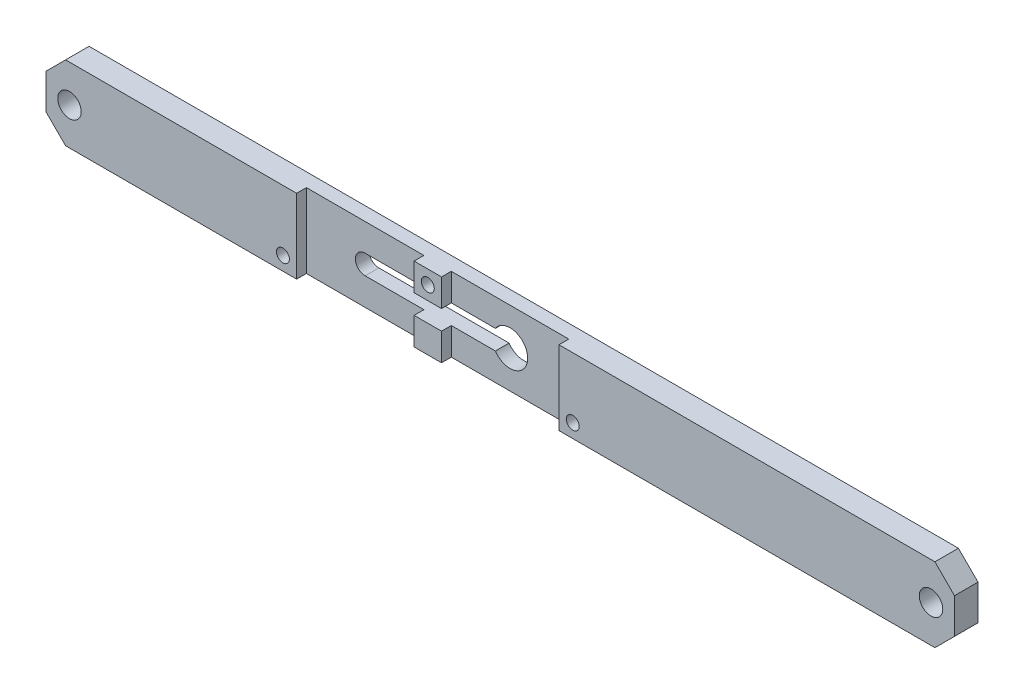
ISO-10303-21;
HEADER;
FILE_DESCRIPTION(('STEP AP214'),'2;1');
FILE_NAME('part.step','',(''),(''),'','','');
FILE_SCHEMA(('AUTOMOTIVE_DESIGN { 1 0 10303 214 1 1 1 1 }'));
ENDSEC;
DATA;
#1=APPLICATION_CONTEXT('core data for automotive mechanical design processes');
#2=APPLICATION_PROTOCOL_DEFINITION('international standard','automotive_design',2000,#1);
#3=PRODUCT_CONTEXT('',#1,'mechanical');
#4=PRODUCT('Part','Part','',(#3));
#5=PRODUCT_RELATED_PRODUCT_CATEGORY('part','',(#4));
#6=PRODUCT_DEFINITION_FORMATION('','',#4);
#7=PRODUCT_DEFINITION_CONTEXT('part definition',#1,'design');
#8=PRODUCT_DEFINITION('design','',#6,#7);
#9=PRODUCT_DEFINITION_SHAPE('','',#8);
#10=(LENGTH_UNIT() NAMED_UNIT(*) SI_UNIT(.MILLI.,.METRE.));
#11=(NAMED_UNIT(*) PLANE_ANGLE_UNIT() SI_UNIT($,.RADIAN.));
#12=(NAMED_UNIT(*) SI_UNIT($,.STERADIAN.) SOLID_ANGLE_UNIT());
#13=UNCERTAINTY_MEASURE_WITH_UNIT(LENGTH_MEASURE(1.E-05),#10,'distance_accuracy_value','');
#14=(GEOMETRIC_REPRESENTATION_CONTEXT(3) GLOBAL_UNCERTAINTY_ASSIGNED_CONTEXT((#13)) GLOBAL_UNIT_ASSIGNED_CONTEXT((#10,
#11,#12)) REPRESENTATION_CONTEXT('',''));
#15=CARTESIAN_POINT('',(0.,0.,0.));
#16=DIRECTION('',(0.,0.,1.));
#17=DIRECTION('',(1.,0.,0.));
#18=AXIS2_PLACEMENT_3D('',#15,#16,#17);
#19=CARTESIAN_POINT('',(0.,0.,6.));
#20=DIRECTION('',(0.,0.,1.));
#21=DIRECTION('',(1.,0.,0.));
#22=AXIS2_PLACEMENT_3D('',#19,#20,#21);
#23=PLANE('',#22);
#24=CARTESIAN_POINT('',(-18.5000000000002,6.,6.));
#25=DIRECTION('',(0.,0.,-1.));
#26=DIRECTION('',(-1.,0.,0.));
#27=AXIS2_PLACEMENT_3D('',#24,#25,#26);
#28=CIRCLE('',#27,1.65);
#29=CARTESIAN_POINT('',(-20.1500000000002,6.,6.));
#30=VERTEX_POINT('',#29);
#31=EDGE_CURVE('E741',#30,#30,#28,.T.);
#32=ORIENTED_EDGE('',*,*,#31,.T.);
#33=EDGE_LOOP('',(#32));
#34=FACE_BOUND('',#33,.T.);
#35=DIRECTION('',(0.,1.,0.));
#36=VECTOR('',#35,1.);
#37=CARTESIAN_POINT('',(-22.0000000000002,9.50000000000001,6.));
#38=LINE('',#37,#36);
#39=CARTESIAN_POINT('',(-22.0000000000002,2.5,6.));
#40=VERTEX_POINT('',#39);
#41=CARTESIAN_POINT('',(-22.0000000000002,9.50000000000001,6.));
#42=VERTEX_POINT('',#41);
#43=EDGE_CURVE('E293',#40,#42,#38,.T.);
#44=ORIENTED_EDGE('',*,*,#43,.F.);
#45=DIRECTION('',(1.,0.,0.));
#46=VECTOR('',#45,1.);
#47=CARTESIAN_POINT('',(0.,2.5,6.));
#48=LINE('',#47,#46);
#49=CARTESIAN_POINT('',(-15.0000000000002,2.5,6.));
#50=VERTEX_POINT('',#49);
#51=EDGE_CURVE('E234',#40,#50,#48,.T.);
#52=ORIENTED_EDGE('',*,*,#51,.T.);
#53=DIRECTION('',(0.,-1.,0.));
#54=VECTOR('',#53,1.);
#55=CARTESIAN_POINT('',(-15.0000000000002,9.50000000000001,6.));
#56=LINE('',#55,#54);
#57=CARTESIAN_POINT('',(-15.0000000000002,9.50000000000001,6.));
#58=VERTEX_POINT('',#57);
#59=EDGE_CURVE('E298',#58,#50,#56,.T.);
#60=ORIENTED_EDGE('',*,*,#59,.F.);
#61=DIRECTION('',(-1.,0.,0.));
#62=VECTOR('',#61,1.);
#63=CARTESIAN_POINT('',(116.,9.50000000000001,6.));
#64=LINE('',#63,#62);
#65=EDGE_CURVE('E349',#58,#42,#64,.T.);
#66=ORIENTED_EDGE('',*,*,#65,.T.);
#67=EDGE_LOOP('',(#44,#52,#60,#66));
#68=FACE_BOUND('',#67,.T.);
#69=ADVANCED_FACE('F44',(#34,#68),#23,.T.);
#70=CARTESIAN_POINT('',(-15.0000000000002,9.50000000000001,3.5));
#71=DIRECTION('',(-1.,0.,0.));
#72=DIRECTION('',(0.,0.,1.));
#73=AXIS2_PLACEMENT_3D('',#70,#71,#72);
#74=PLANE('',#73);
#75=DIRECTION('',(0.,0.,1.));
#76=VECTOR('',#75,1.);
#77=CARTESIAN_POINT('',(-15.0000000000002,2.5,3.5));
#78=LINE('',#77,#76);
#79=CARTESIAN_POINT('',(-15.0000000000002,2.5,3.5));
#80=VERTEX_POINT('',#79);
#81=EDGE_CURVE('E254',#80,#50,#78,.T.);
#82=ORIENTED_EDGE('',*,*,#81,.F.);
#83=DIRECTION('',(0.,-1.,0.));
#84=VECTOR('',#83,1.);
#85=CARTESIAN_POINT('',(-15.0000000000002,9.50000000000001,3.5));
#86=LINE('',#85,#84);
#87=CARTESIAN_POINT('',(-15.0000000000002,9.50000000000001,3.5));
#88=VERTEX_POINT('',#87);
#89=EDGE_CURVE('E329',#88,#80,#86,.T.);
#90=ORIENTED_EDGE('',*,*,#89,.F.);
#91=DIRECTION('',(0.,0.,1.));
#92=VECTOR('',#91,1.);
#93=CARTESIAN_POINT('',(-15.0000000000002,9.50000000000001,3.5));
#94=LINE('',#93,#92);
#95=EDGE_CURVE('E310',#88,#58,#94,.T.);
#96=ORIENTED_EDGE('',*,*,#95,.T.);
#97=ORIENTED_EDGE('',*,*,#59,.T.);
#98=EDGE_LOOP('',(#82,#90,#96,#97));
#99=FACE_BOUND('',#98,.T.);
#100=ADVANCED_FACE('F477',(#99),#74,.F.);
#101=CARTESIAN_POINT('',(-22.0000000000002,9.50000000000001,3.5));
#102=DIRECTION('',(1.,0.,0.));
#103=DIRECTION('',(0.,0.,-1.));
#104=AXIS2_PLACEMENT_3D('',#101,#102,#103);
#105=PLANE('',#104);
#106=DIRECTION('',(0.,0.,-1.));
#107=VECTOR('',#106,1.);
#108=CARTESIAN_POINT('',(-22.0000000000002,2.5,3.5));
#109=LINE('',#108,#107);
#110=CARTESIAN_POINT('',(-22.0000000000002,2.5,3.5));
#111=VERTEX_POINT('',#110);
#112=EDGE_CURVE('E250',#40,#111,#109,.T.);
#113=ORIENTED_EDGE('',*,*,#112,.F.);
#114=ORIENTED_EDGE('',*,*,#43,.T.);
#115=DIRECTION('',(0.,0.,1.));
#116=VECTOR('',#115,1.);
#117=CARTESIAN_POINT('',(-22.0000000000002,9.50000000000001,3.5));
#118=LINE('',#117,#116);
#119=CARTESIAN_POINT('',(-22.0000000000002,9.50000000000001,3.5));
#120=VERTEX_POINT('',#119);
#121=EDGE_CURVE('E305',#120,#42,#118,.T.);
#122=ORIENTED_EDGE('',*,*,#121,.F.);
#123=DIRECTION('',(0.,1.,0.));
#124=VECTOR('',#123,1.);
#125=CARTESIAN_POINT('',(-22.0000000000002,9.50000000000001,3.5));
#126=LINE('',#125,#124);
#127=EDGE_CURVE('E284',#111,#120,#126,.T.);
#128=ORIENTED_EDGE('',*,*,#127,.F.);
#129=EDGE_LOOP('',(#113,#114,#122,#128));
#130=FACE_BOUND('',#129,.T.);
#131=ADVANCED_FACE('F466',(#130),#105,.F.);
#132=CARTESIAN_POINT('',(-55.5000000000002,-6.,6.));
#133=DIRECTION('',(0.,0.,-1.));
#134=DIRECTION('',(-1.,0.,0.));
#135=AXIS2_PLACEMENT_3D('',#132,#133,#134);
#136=CIRCLE('',#135,1.65);
#137=CARTESIAN_POINT('',(-57.1500000000002,-6.,6.));
#138=VERTEX_POINT('',#137);
#139=EDGE_CURVE('E754',#138,#138,#136,.T.);
#140=ORIENTED_EDGE('',*,*,#139,.T.);
#141=EDGE_LOOP('',(#140));
#142=FACE_BOUND('',#141,.T.);
#143=CARTESIAN_POINT('',(-110.,0.,6.));
#144=DIRECTION('',(0.,0.,1.));
#145=DIRECTION('',(1.,0.,0.));
#146=AXIS2_PLACEMENT_3D('',#143,#144,#145);
#147=CIRCLE('',#146,3.00000000000001);
#148=CARTESIAN_POINT('',(-107.,0.,6.));
#149=VERTEX_POINT('',#148);
#150=EDGE_CURVE('E275',#149,#149,#147,.T.);
#151=ORIENTED_EDGE('',*,*,#150,.F.);
#152=EDGE_LOOP('',(#151));
#153=FACE_BOUND('',#152,.T.);
#154=CARTESIAN_POINT('',(-52.0000000000002,9.50000000000001,6.));
#155=VERTEX_POINT('',#154);
#156=CARTESIAN_POINT('',(-111.,9.50000000000001,6.));
#157=VERTEX_POINT('',#156);
#158=EDGE_CURVE('E343',#155,#157,#64,.T.);
#159=ORIENTED_EDGE('',*,*,#158,.T.);
#160=DIRECTION('',(0.707106781186549,0.707106781186546,0.));
#161=VECTOR('',#160,1.);
#162=CARTESIAN_POINT('',(-60.2499999999998,60.2500000000001,6.));
#163=LINE('',#162,#161);
#164=CARTESIAN_POINT('',(-116.,4.5,6.));
#165=VERTEX_POINT('',#164);
#166=EDGE_CURVE('E11',#157,#165,#163,.F.);
#167=ORIENTED_EDGE('',*,*,#166,.T.);
#168=DIRECTION('',(0.,-1.,0.));
#169=VECTOR('',#168,1.);
#170=CARTESIAN_POINT('',(-116.,-9.49999999999999,6.));
#171=LINE('',#170,#169);
#172=CARTESIAN_POINT('',(-116.,-4.50000000000002,6.));
#173=VERTEX_POINT('',#172);
#174=EDGE_CURVE('E333',#165,#173,#171,.T.);
#175=ORIENTED_EDGE('',*,*,#174,.T.);
#176=DIRECTION('',(-0.707106781186548,0.707106781186548,0.));
#177=VECTOR('',#176,1.);
#178=CARTESIAN_POINT('',(-60.2500000000001,-60.2500000000001,6.));
#179=LINE('',#178,#177);
#180=CARTESIAN_POINT('',(-111.,-9.49999999999999,6.));
#181=VERTEX_POINT('',#180);
#182=EDGE_CURVE('E53',#173,#181,#179,.F.);
#183=ORIENTED_EDGE('',*,*,#182,.T.);
#184=DIRECTION('',(1.,0.,0.));
#185=VECTOR('',#184,1.);
#186=CARTESIAN_POINT('',(116.,-9.49999999999999,6.));
#187=LINE('',#186,#185);
#188=CARTESIAN_POINT('',(-52.0000000000002,-9.49999999999999,6.));
#189=VERTEX_POINT('',#188);
#190=EDGE_CURVE('E339',#181,#189,#187,.T.);
#191=ORIENTED_EDGE('',*,*,#190,.T.);
#192=DIRECTION('',(0.,-1.,0.));
#193=VECTOR('',#192,1.);
#194=CARTESIAN_POINT('',(-52.0000000000002,9.50000000000001,6.));
#195=LINE('',#194,#193);
#196=EDGE_CURVE('E295',#155,#189,#195,.T.);
#197=ORIENTED_EDGE('',*,*,#196,.F.);
#198=EDGE_LOOP('',(#159,#167,#175,#183,#191,#197));
#199=FACE_BOUND('',#198,.T.);
#200=ADVANCED_FACE('F396',(#142,#153,#199),#23,.T.);
#201=DIRECTION('',(1.,0.,0.));
#202=VECTOR('',#201,1.);
#203=CARTESIAN_POINT('',(0.,-2.5,6.));
#204=LINE('',#203,#202);
#205=CARTESIAN_POINT('',(-22.0000000000002,-2.5,6.));
#206=VERTEX_POINT('',#205);
#207=CARTESIAN_POINT('',(-15.0000000000002,-2.5,6.));
#208=VERTEX_POINT('',#207);
#209=EDGE_CURVE('E237',#206,#208,#204,.T.);
#210=ORIENTED_EDGE('',*,*,#209,.F.);
#211=CARTESIAN_POINT('',(-22.0000000000002,-9.49999999999999,6.));
#212=VERTEX_POINT('',#211);
#213=EDGE_CURVE('E283',#212,#206,#38,.T.);
#214=ORIENTED_EDGE('',*,*,#213,.F.);
#215=CARTESIAN_POINT('',(-15.0000000000002,-9.49999999999999,6.));
#216=VERTEX_POINT('',#215);
#217=EDGE_CURVE('E345',#212,#216,#187,.T.);
#218=ORIENTED_EDGE('',*,*,#217,.T.);
#219=EDGE_CURVE('E325',#208,#216,#56,.T.);
#220=ORIENTED_EDGE('',*,*,#219,.F.);
#221=EDGE_LOOP('',(#210,#214,#218,#220));
#222=FACE_BOUND('',#221,.T.);
#223=ADVANCED_FACE('F443',(#222),#23,.T.);
#224=CARTESIAN_POINT('',(-116.,-9.49999999999999,6.));
#225=DIRECTION('',(1.,0.,0.));
#226=DIRECTION('',(0.,0.,-1.));
#227=AXIS2_PLACEMENT_3D('',#224,#225,#226);
#228=PLANE('',#227);
#229=ORIENTED_EDGE('',*,*,#174,.F.);
#230=DIRECTION('',(0.,0.,-1.));
#231=VECTOR('',#230,1.);
#232=CARTESIAN_POINT('',(-116.,4.5,6.));
#233=LINE('',#232,#231);
#234=CARTESIAN_POINT('',(-116.,4.5,0.));
#235=VERTEX_POINT('',#234);
#236=EDGE_CURVE('E392',#165,#235,#233,.T.);
#237=ORIENTED_EDGE('',*,*,#236,.T.);
#238=DIRECTION('',(0.,-1.,0.));
#239=VECTOR('',#238,1.);
#240=CARTESIAN_POINT('',(-116.,-9.49999999999999,0.));
#241=LINE('',#240,#239);
#242=CARTESIAN_POINT('',(-116.,-4.50000000000002,0.));
#243=VERTEX_POINT('',#242);
#244=EDGE_CURVE('E302',#235,#243,#241,.T.);
#245=ORIENTED_EDGE('',*,*,#244,.T.);
#246=DIRECTION('',(0.,0.,1.));
#247=VECTOR('',#246,1.);
#248=CARTESIAN_POINT('',(-116.,-4.50000000000002,6.));
#249=LINE('',#248,#247);
#250=EDGE_CURVE('E63',#243,#173,#249,.T.);
#251=ORIENTED_EDGE('',*,*,#250,.T.);
#252=EDGE_LOOP('',(#229,#237,#245,#251));
#253=FACE_BOUND('',#252,.T.);
#254=ADVANCED_FACE('F407',(#253),#228,.F.);
#255=CARTESIAN_POINT('',(116.,-9.49999999999999,6.));
#256=DIRECTION('',(0.,1.,0.));
#257=DIRECTION('',(0.,0.,1.));
#258=AXIS2_PLACEMENT_3D('',#255,#256,#257);
#259=PLANE('',#258);
#260=DIRECTION('',(1.,0.,0.));
#261=VECTOR('',#260,1.);
#262=CARTESIAN_POINT('',(116.,-9.49999999999999,0.));
#263=LINE('',#262,#261);
#264=CARTESIAN_POINT('',(-111.,-9.49999999999999,0.));
#265=VERTEX_POINT('',#264);
#266=CARTESIAN_POINT('',(111.,-9.49999999999999,0.));
#267=VERTEX_POINT('',#266);
#268=EDGE_CURVE('E353',#265,#267,#263,.T.);
#269=ORIENTED_EDGE('',*,*,#268,.T.);
#270=DIRECTION('',(0.,0.,1.));
#271=VECTOR('',#270,1.);
#272=CARTESIAN_POINT('',(111.,-9.49999999999999,6.));
#273=LINE('',#272,#271);
#274=CARTESIAN_POINT('',(111.,-9.49999999999999,6.));
#275=VERTEX_POINT('',#274);
#276=EDGE_CURVE('E382',#267,#275,#273,.T.);
#277=ORIENTED_EDGE('',*,*,#276,.T.);
#278=CARTESIAN_POINT('',(14.9999999999998,-9.49999999999999,6.));
#279=VERTEX_POINT('',#278);
#280=EDGE_CURVE('E340',#279,#275,#187,.T.);
#281=ORIENTED_EDGE('',*,*,#280,.F.);
#282=DIRECTION('',(0.,0.,1.));
#283=VECTOR('',#282,1.);
#284=CARTESIAN_POINT('',(14.9999999999998,-9.49999999999999,3.5));
#285=LINE('',#284,#283);
#286=CARTESIAN_POINT('',(14.9999999999998,-9.49999999999999,3.5));
#287=VERTEX_POINT('',#286);
#288=EDGE_CURVE('E312',#287,#279,#285,.T.);
#289=ORIENTED_EDGE('',*,*,#288,.F.);
#290=DIRECTION('',(1.,0.,0.));
#291=VECTOR('',#290,1.);
#292=CARTESIAN_POINT('',(-15.0000000000002,-9.49999999999999,3.5));
#293=LINE('',#292,#291);
#294=CARTESIAN_POINT('',(-15.0000000000002,-9.49999999999999,3.5));
#295=VERTEX_POINT('',#294);
#296=EDGE_CURVE('E330',#295,#287,#293,.T.);
#297=ORIENTED_EDGE('',*,*,#296,.F.);
#298=DIRECTION('',(0.,0.,1.));
#299=VECTOR('',#298,1.);
#300=CARTESIAN_POINT('',(-15.0000000000002,-9.49999999999999,3.5));
#301=LINE('',#300,#299);
#302=EDGE_CURVE('E315',#295,#216,#301,.T.);
#303=ORIENTED_EDGE('',*,*,#302,.T.);
#304=ORIENTED_EDGE('',*,*,#217,.F.);
#305=DIRECTION('',(0.,0.,1.));
#306=VECTOR('',#305,1.);
#307=CARTESIAN_POINT('',(-22.0000000000002,-9.49999999999999,3.5));
#308=LINE('',#307,#306);
#309=CARTESIAN_POINT('',(-22.0000000000002,-9.49999999999999,3.5));
#310=VERTEX_POINT('',#309);
#311=EDGE_CURVE('E303',#310,#212,#308,.T.);
#312=ORIENTED_EDGE('',*,*,#311,.F.);
#313=DIRECTION('',(1.,0.,0.));
#314=VECTOR('',#313,1.);
#315=CARTESIAN_POINT('',(-52.0000000000002,-9.49999999999999,3.5));
#316=LINE('',#315,#314);
#317=CARTESIAN_POINT('',(-52.0000000000002,-9.49999999999999,3.5));
#318=VERTEX_POINT('',#317);
#319=EDGE_CURVE('E278',#318,#310,#316,.T.);
#320=ORIENTED_EDGE('',*,*,#319,.F.);
#321=DIRECTION('',(0.,0.,1.));
#322=VECTOR('',#321,1.);
#323=CARTESIAN_POINT('',(-52.0000000000002,-9.49999999999999,3.5));
#324=LINE('',#323,#322);
#325=EDGE_CURVE('E292',#318,#189,#324,.T.);
#326=ORIENTED_EDGE('',*,*,#325,.T.);
#327=ORIENTED_EDGE('',*,*,#190,.F.);
#328=DIRECTION('',(0.,0.,-1.));
#329=VECTOR('',#328,1.);
#330=CARTESIAN_POINT('',(-111.,-9.49999999999999,6.));
#331=LINE('',#330,#329);
#332=EDGE_CURVE('E379',#181,#265,#331,.T.);
#333=ORIENTED_EDGE('',*,*,#332,.T.);
#334=EDGE_LOOP('',(#269,#277,#281,#289,#297,#303,#304,#312,#320,#326,#327,#333));
#335=FACE_BOUND('',#334,.T.);
#336=ADVANCED_FACE('F404',(#335),#259,.F.);
#337=CARTESIAN_POINT('',(116.,-9.49999999999999,6.));
#338=DIRECTION('',(-1.,0.,0.));
#339=DIRECTION('',(0.,0.,1.));
#340=AXIS2_PLACEMENT_3D('',#337,#338,#339);
#341=PLANE('',#340);
#342=DIRECTION('',(0.,1.,0.));
#343=VECTOR('',#342,1.);
#344=CARTESIAN_POINT('',(116.,-9.49999999999999,6.));
#345=LINE('',#344,#343);
#346=CARTESIAN_POINT('',(116.,-4.49999999999999,6.));
#347=VERTEX_POINT('',#346);
#348=CARTESIAN_POINT('',(116.,4.49999999999998,6.));
#349=VERTEX_POINT('',#348);
#350=EDGE_CURVE('E342',#347,#349,#345,.T.);
#351=ORIENTED_EDGE('',*,*,#350,.F.);
#352=DIRECTION('',(0.,0.,-1.));
#353=VECTOR('',#352,1.);
#354=CARTESIAN_POINT('',(116.,-4.49999999999999,6.));
#355=LINE('',#354,#353);
#356=CARTESIAN_POINT('',(116.,-4.49999999999999,0.));
#357=VERTEX_POINT('',#356);
#358=EDGE_CURVE('E369',#347,#357,#355,.T.);
#359=ORIENTED_EDGE('',*,*,#358,.T.);
#360=DIRECTION('',(0.,1.,0.));
#361=VECTOR('',#360,1.);
#362=CARTESIAN_POINT('',(116.,-9.49999999999999,0.));
#363=LINE('',#362,#361);
#364=CARTESIAN_POINT('',(116.,4.49999999999998,0.));
#365=VERTEX_POINT('',#364);
#366=EDGE_CURVE('E354',#357,#365,#363,.T.);
#367=ORIENTED_EDGE('',*,*,#366,.T.);
#368=DIRECTION('',(0.,0.,1.));
#369=VECTOR('',#368,1.);
#370=CARTESIAN_POINT('',(116.,4.49999999999998,6.));
#371=LINE('',#370,#369);
#372=EDGE_CURVE('E370',#365,#349,#371,.T.);
#373=ORIENTED_EDGE('',*,*,#372,.T.);
#374=EDGE_LOOP('',(#351,#359,#367,#373));
#375=FACE_BOUND('',#374,.T.);
#376=ADVANCED_FACE('F430',(#375),#341,.F.);
#377=CARTESIAN_POINT('',(116.,9.50000000000001,6.));
#378=DIRECTION('',(0.,-1.,0.));
#379=DIRECTION('',(0.,0.,-1.));
#380=AXIS2_PLACEMENT_3D('',#377,#378,#379);
#381=PLANE('',#380);
#382=CARTESIAN_POINT('',(111.,9.50000000000001,6.));
#383=VERTEX_POINT('',#382);
#384=CARTESIAN_POINT('',(14.9999999999998,9.50000000000001,6.));
#385=VERTEX_POINT('',#384);
#386=EDGE_CURVE('E347',#383,#385,#64,.T.);
#387=ORIENTED_EDGE('',*,*,#386,.F.);
#388=DIRECTION('',(0.,0.,-1.));
#389=VECTOR('',#388,1.);
#390=CARTESIAN_POINT('',(111.,9.50000000000001,6.));
#391=LINE('',#390,#389);
#392=CARTESIAN_POINT('',(111.,9.50000000000001,0.));
#393=VERTEX_POINT('',#392);
#394=EDGE_CURVE('E393',#383,#393,#391,.T.);
#395=ORIENTED_EDGE('',*,*,#394,.T.);
#396=DIRECTION('',(-1.,0.,0.));
#397=VECTOR('',#396,1.);
#398=CARTESIAN_POINT('',(116.,9.50000000000001,0.));
#399=LINE('',#398,#397);
#400=CARTESIAN_POINT('',(-111.,9.50000000000001,0.));
#401=VERTEX_POINT('',#400);
#402=EDGE_CURVE('E336',#393,#401,#399,.T.);
#403=ORIENTED_EDGE('',*,*,#402,.T.);
#404=DIRECTION('',(0.,0.,1.));
#405=VECTOR('',#404,1.);
#406=CARTESIAN_POINT('',(-111.,9.50000000000001,6.));
#407=LINE('',#406,#405);
#408=EDGE_CURVE('E386',#401,#157,#407,.T.);
#409=ORIENTED_EDGE('',*,*,#408,.T.);
#410=ORIENTED_EDGE('',*,*,#158,.F.);
#411=DIRECTION('',(0.,0.,1.));
#412=VECTOR('',#411,1.);
#413=CARTESIAN_POINT('',(-52.0000000000002,9.50000000000001,3.5));
#414=LINE('',#413,#412);
#415=CARTESIAN_POINT('',(-52.0000000000002,9.50000000000001,3.5));
#416=VERTEX_POINT('',#415);
#417=EDGE_CURVE('E299',#416,#155,#414,.T.);
#418=ORIENTED_EDGE('',*,*,#417,.F.);
#419=DIRECTION('',(-1.,0.,0.));
#420=VECTOR('',#419,1.);
#421=CARTESIAN_POINT('',(-52.0000000000002,9.50000000000001,3.5));
#422=LINE('',#421,#420);
#423=EDGE_CURVE('E289',#120,#416,#422,.T.);
#424=ORIENTED_EDGE('',*,*,#423,.F.);
#425=ORIENTED_EDGE('',*,*,#121,.T.);
#426=ORIENTED_EDGE('',*,*,#65,.F.);
#427=ORIENTED_EDGE('',*,*,#95,.F.);
#428=DIRECTION('',(-1.,0.,0.));
#429=VECTOR('',#428,1.);
#430=CARTESIAN_POINT('',(-15.0000000000002,9.50000000000001,3.5));
#431=LINE('',#430,#429);
#432=CARTESIAN_POINT('',(14.9999999999998,9.50000000000001,3.5));
#433=VERTEX_POINT('',#432);
#434=EDGE_CURVE('E323',#433,#88,#431,.T.);
#435=ORIENTED_EDGE('',*,*,#434,.F.);
#436=DIRECTION('',(0.,0.,1.));
#437=VECTOR('',#436,1.);
#438=CARTESIAN_POINT('',(14.9999999999998,9.50000000000001,3.5));
#439=LINE('',#438,#437);
#440=EDGE_CURVE('E268',#433,#385,#439,.T.);
#441=ORIENTED_EDGE('',*,*,#440,.T.);
#442=EDGE_LOOP('',(#387,#395,#403,#409,#410,#418,#424,#425,#426,#427,#435,#441));
#443=FACE_BOUND('',#442,.T.);
#444=ADVANCED_FACE('F416',(#443),#381,.F.);
#445=CARTESIAN_POINT('',(18.4999999999998,-6.,6.));
#446=DIRECTION('',(0.,0.,-1.));
#447=DIRECTION('',(-1.,0.,0.));
#448=AXIS2_PLACEMENT_3D('',#445,#446,#447);
#449=CIRCLE('',#448,1.65);
#450=CARTESIAN_POINT('',(16.8499999999998,-6.,6.));
#451=VERTEX_POINT('',#450);
#452=EDGE_CURVE('E239',#451,#451,#449,.T.);
#453=ORIENTED_EDGE('',*,*,#452,.T.);
#454=EDGE_LOOP('',(#453));
#455=FACE_BOUND('',#454,.T.);
#456=CARTESIAN_POINT('',(110.,0.,6.));
#457=DIRECTION('',(0.,0.,1.));
#458=DIRECTION('',(1.,0.,0.));
#459=AXIS2_PLACEMENT_3D('',#456,#457,#458);
#460=CIRCLE('',#459,3.00000000000001);
#461=CARTESIAN_POINT('',(113.,0.,6.));
#462=VERTEX_POINT('',#461);
#463=EDGE_CURVE('E267',#462,#462,#460,.T.);
#464=ORIENTED_EDGE('',*,*,#463,.F.);
#465=EDGE_LOOP('',(#464));
#466=FACE_BOUND('',#465,.T.);
#467=ORIENTED_EDGE('',*,*,#280,.T.);
#468=DIRECTION('',(-0.707106781186549,-0.707106781186546,0.));
#469=VECTOR('',#468,1.);
#470=CARTESIAN_POINT('',(60.2499999999996,-60.2499999999999,6.));
#471=LINE('',#470,#469);
#472=EDGE_CURVE('E390',#275,#347,#471,.F.);
#473=ORIENTED_EDGE('',*,*,#472,.T.);
#474=ORIENTED_EDGE('',*,*,#350,.T.);
#475=DIRECTION('',(0.707106781186546,-0.707106781186549,0.));
#476=VECTOR('',#475,1.);
#477=CARTESIAN_POINT('',(60.2500000000002,60.2499999999999,6.));
#478=LINE('',#477,#476);
#479=EDGE_CURVE('E384',#349,#383,#478,.F.);
#480=ORIENTED_EDGE('',*,*,#479,.T.);
#481=ORIENTED_EDGE('',*,*,#386,.T.);
#482=DIRECTION('',(0.,1.,0.));
#483=VECTOR('',#482,1.);
#484=CARTESIAN_POINT('',(14.9999999999998,9.50000000000001,6.));
#485=LINE('',#484,#483);
#486=EDGE_CURVE('E317',#279,#385,#485,.T.);
#487=ORIENTED_EDGE('',*,*,#486,.F.);
#488=EDGE_LOOP('',(#467,#473,#474,#480,#481,#487));
#489=FACE_BOUND('',#488,.T.);
#490=ADVANCED_FACE('F437',(#455,#466,#489),#23,.T.);
#491=CARTESIAN_POINT('',(0.,0.,0.));
#492=DIRECTION('',(0.,0.,1.));
#493=DIRECTION('',(1.,0.,0.));
#494=AXIS2_PLACEMENT_3D('',#491,#492,#493);
#495=PLANE('',#494);
#496=CARTESIAN_POINT('',(-18.5000000000002,6.,0.));
#497=DIRECTION('',(0.,0.,-1.));
#498=DIRECTION('',(-1.,0.,0.));
#499=AXIS2_PLACEMENT_3D('',#496,#497,#498);
#500=CIRCLE('',#499,3.);
#501=CARTESIAN_POINT('',(-21.5000000000002,6.,0.));
#502=VERTEX_POINT('',#501);
#503=EDGE_CURVE('E745',#502,#502,#500,.T.);
#504=ORIENTED_EDGE('',*,*,#503,.F.);
#505=EDGE_LOOP('',(#504));
#506=FACE_BOUND('',#505,.T.);
#507=CARTESIAN_POINT('',(-55.5000000000002,-6.,0.));
#508=DIRECTION('',(0.,0.,-1.));
#509=DIRECTION('',(-1.,0.,0.));
#510=AXIS2_PLACEMENT_3D('',#507,#508,#509);
#511=CIRCLE('',#510,3.);
#512=CARTESIAN_POINT('',(-58.5000000000002,-6.,0.));
#513=VERTEX_POINT('',#512);
#514=EDGE_CURVE('E746',#513,#513,#511,.T.);
#515=ORIENTED_EDGE('',*,*,#514,.F.);
#516=EDGE_LOOP('',(#515));
#517=FACE_BOUND('',#516,.T.);
#518=CARTESIAN_POINT('',(18.4999999999998,-6.,0.));
#519=DIRECTION('',(0.,0.,-1.));
#520=DIRECTION('',(-1.,0.,0.));
#521=AXIS2_PLACEMENT_3D('',#518,#519,#520);
#522=CIRCLE('',#521,3.);
#523=CARTESIAN_POINT('',(15.4999999999998,-6.,0.));
#524=VERTEX_POINT('',#523);
#525=EDGE_CURVE('E760',#524,#524,#522,.T.);
#526=ORIENTED_EDGE('',*,*,#525,.F.);
#527=EDGE_LOOP('',(#526));
#528=FACE_BOUND('',#527,.T.);
#529=CARTESIAN_POINT('',(-37.0000000000002,0.,0.));
#530=DIRECTION('',(0.,0.,1.));
#531=DIRECTION('',(1.,0.,0.));
#532=AXIS2_PLACEMENT_3D('',#529,#530,#531);
#533=CIRCLE('',#532,2.5);
#534=CARTESIAN_POINT('',(-37.0000000000002,2.5,0.));
#535=VERTEX_POINT('',#534);
#536=CARTESIAN_POINT('',(-37.0000000000002,-2.5,0.));
#537=VERTEX_POINT('',#536);
#538=EDGE_CURVE('E218',#535,#537,#533,.T.);
#539=ORIENTED_EDGE('',*,*,#538,.T.);
#540=DIRECTION('',(1.,0.,0.));
#541=VECTOR('',#540,1.);
#542=CARTESIAN_POINT('',(0.,-2.5,0.));
#543=LINE('',#542,#541);
#544=CARTESIAN_POINT('',(-3.74165738677415,-2.5,0.));
#545=VERTEX_POINT('',#544);
#546=EDGE_CURVE('E215',#537,#545,#543,.T.);
#547=ORIENTED_EDGE('',*,*,#546,.T.);
#548=CARTESIAN_POINT('',(-2.08166817117217E-13,0.,0.));
#549=DIRECTION('',(0.,0.,1.));
#550=DIRECTION('',(1.,0.,0.));
#551=AXIS2_PLACEMENT_3D('',#548,#549,#550);
#552=CIRCLE('',#551,4.5);
#553=CARTESIAN_POINT('',(-3.74165738677415,2.5,0.));
#554=VERTEX_POINT('',#553);
#555=EDGE_CURVE('E225',#545,#554,#552,.T.);
#556=ORIENTED_EDGE('',*,*,#555,.T.);
#557=DIRECTION('',(1.,0.,0.));
#558=VECTOR('',#557,1.);
#559=CARTESIAN_POINT('',(0.,2.5,0.));
#560=LINE('',#559,#558);
#561=EDGE_CURVE('E226',#535,#554,#560,.T.);
#562=ORIENTED_EDGE('',*,*,#561,.F.);
#563=EDGE_LOOP('',(#539,#547,#556,#562));
#564=FACE_BOUND('',#563,.T.);
#565=CARTESIAN_POINT('',(110.,0.,0.));
#566=DIRECTION('',(0.,0.,1.));
#567=DIRECTION('',(1.,0.,0.));
#568=AXIS2_PLACEMENT_3D('',#565,#566,#567);
#569=CIRCLE('',#568,3.00000000000001);
#570=CARTESIAN_POINT('',(113.,0.,0.));
#571=VERTEX_POINT('',#570);
#572=EDGE_CURVE('E264',#571,#571,#569,.T.);
#573=ORIENTED_EDGE('',*,*,#572,.T.);
#574=EDGE_LOOP('',(#573));
#575=FACE_BOUND('',#574,.T.);
#576=CARTESIAN_POINT('',(-110.,0.,0.));
#577=DIRECTION('',(0.,0.,1.));
#578=DIRECTION('',(1.,0.,0.));
#579=AXIS2_PLACEMENT_3D('',#576,#577,#578);
#580=CIRCLE('',#579,3.00000000000001);
#581=CARTESIAN_POINT('',(-107.,0.,0.));
#582=VERTEX_POINT('',#581);
#583=EDGE_CURVE('E262',#582,#582,#580,.T.);
#584=ORIENTED_EDGE('',*,*,#583,.T.);
#585=EDGE_LOOP('',(#584));
#586=FACE_BOUND('',#585,.T.);
#587=ORIENTED_EDGE('',*,*,#366,.F.);
#588=DIRECTION('',(0.707106781186549,0.707106781186546,0.));
#589=VECTOR('',#588,1.);
#590=CARTESIAN_POINT('',(116.,-4.49999999999999,0.));
#591=LINE('',#590,#589);
#592=EDGE_CURVE('E378',#357,#267,#591,.F.);
#593=ORIENTED_EDGE('',*,*,#592,.T.);
#594=ORIENTED_EDGE('',*,*,#268,.F.);
#595=DIRECTION('',(0.707106781186548,-0.707106781186548,0.));
#596=VECTOR('',#595,1.);
#597=CARTESIAN_POINT('',(-111.,-9.49999999999999,0.));
#598=LINE('',#597,#596);
#599=EDGE_CURVE('E375',#265,#243,#598,.F.);
#600=ORIENTED_EDGE('',*,*,#599,.T.);
#601=ORIENTED_EDGE('',*,*,#244,.F.);
#602=DIRECTION('',(-0.707106781186549,-0.707106781186546,0.));
#603=VECTOR('',#602,1.);
#604=CARTESIAN_POINT('',(-116.,4.5,0.));
#605=LINE('',#604,#603);
#606=EDGE_CURVE('E372',#235,#401,#605,.F.);
#607=ORIENTED_EDGE('',*,*,#606,.T.);
#608=ORIENTED_EDGE('',*,*,#402,.F.);
#609=DIRECTION('',(-0.707106781186546,0.707106781186549,0.));
#610=VECTOR('',#609,1.);
#611=CARTESIAN_POINT('',(111.,9.50000000000001,0.));
#612=LINE('',#611,#610);
#613=EDGE_CURVE('E376',#393,#365,#612,.F.);
#614=ORIENTED_EDGE('',*,*,#613,.T.);
#615=EDGE_LOOP('',(#587,#593,#594,#600,#601,#607,#608,#614));
#616=FACE_BOUND('',#615,.T.);
#617=ADVANCED_FACE('F227',(#506,#517,#528,#564,#575,#586,#616),#495,.F.);
#618=CARTESIAN_POINT('',(14.9999999999998,9.50000000000001,3.5));
#619=DIRECTION('',(1.,0.,0.));
#620=DIRECTION('',(0.,0.,-1.));
#621=AXIS2_PLACEMENT_3D('',#618,#619,#620);
#622=PLANE('',#621);
#623=ORIENTED_EDGE('',*,*,#486,.T.);
#624=ORIENTED_EDGE('',*,*,#440,.F.);
#625=DIRECTION('',(0.,1.,0.));
#626=VECTOR('',#625,1.);
#627=CARTESIAN_POINT('',(14.9999999999998,9.50000000000001,3.5));
#628=LINE('',#627,#626);
#629=EDGE_CURVE('E313',#287,#433,#628,.T.);
#630=ORIENTED_EDGE('',*,*,#629,.F.);
#631=ORIENTED_EDGE('',*,*,#288,.T.);
#632=EDGE_LOOP('',(#623,#624,#630,#631));
#633=FACE_BOUND('',#632,.T.);
#634=ADVANCED_FACE('F505',(#633),#622,.F.);
#635=CARTESIAN_POINT('',(-15.0000000000002,-2.5,3.5));
#636=VERTEX_POINT('',#635);
#637=EDGE_CURVE('E328',#636,#295,#86,.T.);
#638=ORIENTED_EDGE('',*,*,#637,.F.);
#639=DIRECTION('',(0.,0.,1.));
#640=VECTOR('',#639,1.);
#641=CARTESIAN_POINT('',(-15.0000000000002,-2.5,3.5));
#642=LINE('',#641,#640);
#643=EDGE_CURVE('E261',#636,#208,#642,.T.);
#644=ORIENTED_EDGE('',*,*,#643,.T.);
#645=ORIENTED_EDGE('',*,*,#219,.T.);
#646=ORIENTED_EDGE('',*,*,#302,.F.);
#647=EDGE_LOOP('',(#638,#644,#645,#646));
#648=FACE_BOUND('',#647,.T.);
#649=ADVANCED_FACE('F452',(#648),#74,.F.);
#650=CARTESIAN_POINT('',(0.,0.,3.5));
#651=DIRECTION('',(0.,0.,-1.));
#652=DIRECTION('',(-1.,0.,0.));
#653=AXIS2_PLACEMENT_3D('',#650,#651,#652);
#654=PLANE('',#653);
#655=CARTESIAN_POINT('',(-2.08166817117217E-13,0.,3.5));
#656=DIRECTION('',(0.,0.,-1.));
#657=DIRECTION('',(-1.,0.,0.));
#658=AXIS2_PLACEMENT_3D('',#655,#656,#657);
#659=CIRCLE('',#658,4.5);
#660=CARTESIAN_POINT('',(-3.74165738677415,2.5,3.5));
#661=VERTEX_POINT('',#660);
#662=CARTESIAN_POINT('',(-3.74165738677415,-2.5,3.5));
#663=VERTEX_POINT('',#662);
#664=EDGE_CURVE('E364',#661,#663,#659,.T.);
#665=ORIENTED_EDGE('',*,*,#664,.T.);
#666=DIRECTION('',(-1.,0.,0.));
#667=VECTOR('',#666,1.);
#668=CARTESIAN_POINT('',(0.,-2.5,3.5));
#669=LINE('',#668,#667);
#670=EDGE_CURVE('E214',#663,#636,#669,.T.);
#671=ORIENTED_EDGE('',*,*,#670,.T.);
#672=ORIENTED_EDGE('',*,*,#637,.T.);
#673=ORIENTED_EDGE('',*,*,#296,.T.);
#674=ORIENTED_EDGE('',*,*,#629,.T.);
#675=ORIENTED_EDGE('',*,*,#434,.T.);
#676=ORIENTED_EDGE('',*,*,#89,.T.);
#677=DIRECTION('',(-1.,0.,0.));
#678=VECTOR('',#677,1.);
#679=CARTESIAN_POINT('',(0.,2.5,3.5));
#680=LINE('',#679,#678);
#681=EDGE_CURVE('E251',#661,#80,#680,.T.);
#682=ORIENTED_EDGE('',*,*,#681,.F.);
#683=EDGE_LOOP('',(#665,#671,#672,#673,#674,#675,#676,#682));
#684=FACE_BOUND('',#683,.T.);
#685=ADVANCED_FACE('F454',(#684),#654,.F.);
#686=CARTESIAN_POINT('',(-52.0000000000002,9.50000000000001,3.5));
#687=DIRECTION('',(-1.,0.,0.));
#688=DIRECTION('',(0.,0.,1.));
#689=AXIS2_PLACEMENT_3D('',#686,#687,#688);
#690=PLANE('',#689);
#691=ORIENTED_EDGE('',*,*,#196,.T.);
#692=ORIENTED_EDGE('',*,*,#325,.F.);
#693=DIRECTION('',(0.,-1.,0.));
#694=VECTOR('',#693,1.);
#695=CARTESIAN_POINT('',(-52.0000000000002,9.50000000000001,3.5));
#696=LINE('',#695,#694);
#697=EDGE_CURVE('E280',#416,#318,#696,.T.);
#698=ORIENTED_EDGE('',*,*,#697,.F.);
#699=ORIENTED_EDGE('',*,*,#417,.T.);
#700=EDGE_LOOP('',(#691,#692,#698,#699));
#701=FACE_BOUND('',#700,.T.);
#702=ADVANCED_FACE('F470',(#701),#690,.F.);
#703=ORIENTED_EDGE('',*,*,#213,.T.);
#704=DIRECTION('',(0.,0.,-1.));
#705=VECTOR('',#704,1.);
#706=CARTESIAN_POINT('',(-22.0000000000002,-2.5,3.5));
#707=LINE('',#706,#705);
#708=CARTESIAN_POINT('',(-22.0000000000002,-2.5,3.5));
#709=VERTEX_POINT('',#708);
#710=EDGE_CURVE('E260',#206,#709,#707,.T.);
#711=ORIENTED_EDGE('',*,*,#710,.T.);
#712=EDGE_CURVE('E282',#310,#709,#126,.T.);
#713=ORIENTED_EDGE('',*,*,#712,.F.);
#714=ORIENTED_EDGE('',*,*,#311,.T.);
#715=EDGE_LOOP('',(#703,#711,#713,#714));
#716=FACE_BOUND('',#715,.T.);
#717=ADVANCED_FACE('F462',(#716),#105,.F.);
#718=CARTESIAN_POINT('',(0.,0.,3.5));
#719=DIRECTION('',(0.,0.,1.));
#720=DIRECTION('',(1.,0.,0.));
#721=AXIS2_PLACEMENT_3D('',#718,#719,#720);
#722=PLANE('',#721);
#723=DIRECTION('',(1.,0.,0.));
#724=VECTOR('',#723,1.);
#725=CARTESIAN_POINT('',(0.,-2.5,3.5));
#726=LINE('',#725,#724);
#727=CARTESIAN_POINT('',(-37.0000000000002,-2.5,3.5));
#728=VERTEX_POINT('',#727);
#729=EDGE_CURVE('E361',#728,#709,#726,.T.);
#730=ORIENTED_EDGE('',*,*,#729,.F.);
#731=CARTESIAN_POINT('',(-37.0000000000002,0.,3.5));
#732=DIRECTION('',(0.,0.,1.));
#733=DIRECTION('',(1.,0.,0.));
#734=AXIS2_PLACEMENT_3D('',#731,#732,#733);
#735=CIRCLE('',#734,2.5);
#736=CARTESIAN_POINT('',(-37.0000000000002,2.5,3.5));
#737=VERTEX_POINT('',#736);
#738=EDGE_CURVE('E363',#737,#728,#735,.T.);
#739=ORIENTED_EDGE('',*,*,#738,.F.);
#740=DIRECTION('',(1.,0.,0.));
#741=VECTOR('',#740,1.);
#742=CARTESIAN_POINT('',(0.,2.5,3.5));
#743=LINE('',#742,#741);
#744=EDGE_CURVE('E346',#737,#111,#743,.T.);
#745=ORIENTED_EDGE('',*,*,#744,.T.);
#746=ORIENTED_EDGE('',*,*,#127,.T.);
#747=ORIENTED_EDGE('',*,*,#423,.T.);
#748=ORIENTED_EDGE('',*,*,#697,.T.);
#749=ORIENTED_EDGE('',*,*,#319,.T.);
#750=ORIENTED_EDGE('',*,*,#712,.T.);
#751=EDGE_LOOP('',(#730,#739,#745,#746,#747,#748,#749,#750));
#752=FACE_BOUND('',#751,.T.);
#753=ADVANCED_FACE('F461',(#752),#722,.T.);
#754=CARTESIAN_POINT('',(-110.,0.,0.));
#755=DIRECTION('',(0.,0.,1.));
#756=DIRECTION('',(1.,0.,0.));
#757=AXIS2_PLACEMENT_3D('',#754,#755,#756);
#758=CYLINDRICAL_SURFACE('',#757,3.00000000000001);
#759=ORIENTED_EDGE('',*,*,#583,.F.);
#760=EDGE_LOOP('',(#759));
#761=FACE_BOUND('',#760,.T.);
#762=ORIENTED_EDGE('',*,*,#150,.T.);
#763=EDGE_LOOP('',(#762));
#764=FACE_BOUND('',#763,.T.);
#765=ADVANCED_FACE('F475',(#761,#764),#758,.F.);
#766=CARTESIAN_POINT('',(110.,0.,0.));
#767=DIRECTION('',(0.,0.,1.));
#768=DIRECTION('',(1.,0.,0.));
#769=AXIS2_PLACEMENT_3D('',#766,#767,#768);
#770=CYLINDRICAL_SURFACE('',#769,3.00000000000001);
#771=ORIENTED_EDGE('',*,*,#572,.F.);
#772=EDGE_LOOP('',(#771));
#773=FACE_BOUND('',#772,.T.);
#774=ORIENTED_EDGE('',*,*,#463,.T.);
#775=EDGE_LOOP('',(#774));
#776=FACE_BOUND('',#775,.T.);
#777=ADVANCED_FACE('F556',(#773,#776),#770,.F.);
#778=CARTESIAN_POINT('',(-2.08166817117217E-13,0.,0.));
#779=DIRECTION('',(0.,0.,1.));
#780=DIRECTION('',(1.,0.,0.));
#781=AXIS2_PLACEMENT_3D('',#778,#779,#780);
#782=CYLINDRICAL_SURFACE('',#781,4.5);
#783=DIRECTION('',(0.,0.,1.));
#784=VECTOR('',#783,1.);
#785=CARTESIAN_POINT('',(-3.74165738677415,2.5,0.));
#786=LINE('',#785,#784);
#787=EDGE_CURVE('E217',#554,#661,#786,.T.);
#788=ORIENTED_EDGE('',*,*,#787,.F.);
#789=ORIENTED_EDGE('',*,*,#555,.F.);
#790=DIRECTION('',(0.,0.,1.));
#791=VECTOR('',#790,1.);
#792=CARTESIAN_POINT('',(-3.74165738677415,-2.5,0.));
#793=LINE('',#792,#791);
#794=EDGE_CURVE('E210',#545,#663,#793,.T.);
#795=ORIENTED_EDGE('',*,*,#794,.T.);
#796=ORIENTED_EDGE('',*,*,#664,.F.);
#797=EDGE_LOOP('',(#788,#789,#795,#796));
#798=FACE_BOUND('',#797,.T.);
#799=ADVANCED_FACE('F224',(#798),#782,.F.);
#800=CARTESIAN_POINT('',(0.,-2.5,0.));
#801=DIRECTION('',(0.,-1.,0.));
#802=DIRECTION('',(0.,0.,-1.));
#803=AXIS2_PLACEMENT_3D('',#800,#801,#802);
#804=PLANE('',#803);
#805=ORIENTED_EDGE('',*,*,#670,.F.);
#806=ORIENTED_EDGE('',*,*,#794,.F.);
#807=ORIENTED_EDGE('',*,*,#546,.F.);
#808=DIRECTION('',(0.,0.,1.));
#809=VECTOR('',#808,1.);
#810=CARTESIAN_POINT('',(-37.0000000000002,-2.5,0.));
#811=LINE('',#810,#809);
#812=EDGE_CURVE('E242',#537,#728,#811,.T.);
#813=ORIENTED_EDGE('',*,*,#812,.T.);
#814=ORIENTED_EDGE('',*,*,#729,.T.);
#815=ORIENTED_EDGE('',*,*,#710,.F.);
#816=ORIENTED_EDGE('',*,*,#209,.T.);
#817=ORIENTED_EDGE('',*,*,#643,.F.);
#818=EDGE_LOOP('',(#805,#806,#807,#813,#814,#815,#816,#817));
#819=FACE_BOUND('',#818,.T.);
#820=ADVANCED_FACE('F207',(#819),#804,.F.);
#821=CARTESIAN_POINT('',(0.,2.5,0.));
#822=DIRECTION('',(0.,-1.,0.));
#823=DIRECTION('',(0.,0.,-1.));
#824=AXIS2_PLACEMENT_3D('',#821,#822,#823);
#825=PLANE('',#824);
#826=ORIENTED_EDGE('',*,*,#81,.T.);
#827=ORIENTED_EDGE('',*,*,#51,.F.);
#828=ORIENTED_EDGE('',*,*,#112,.T.);
#829=ORIENTED_EDGE('',*,*,#744,.F.);
#830=DIRECTION('',(0.,0.,1.));
#831=VECTOR('',#830,1.);
#832=CARTESIAN_POINT('',(-37.0000000000002,2.5,0.));
#833=LINE('',#832,#831);
#834=EDGE_CURVE('E249',#535,#737,#833,.T.);
#835=ORIENTED_EDGE('',*,*,#834,.F.);
#836=ORIENTED_EDGE('',*,*,#561,.T.);
#837=ORIENTED_EDGE('',*,*,#787,.T.);
#838=ORIENTED_EDGE('',*,*,#681,.T.);
#839=EDGE_LOOP('',(#826,#827,#828,#829,#835,#836,#837,#838));
#840=FACE_BOUND('',#839,.T.);
#841=ADVANCED_FACE('F457',(#840),#825,.T.);
#842=CARTESIAN_POINT('',(-37.0000000000002,0.,0.));
#843=DIRECTION('',(0.,0.,1.));
#844=DIRECTION('',(1.,0.,0.));
#845=AXIS2_PLACEMENT_3D('',#842,#843,#844);
#846=CYLINDRICAL_SURFACE('',#845,2.5);
#847=ORIENTED_EDGE('',*,*,#738,.T.);
#848=ORIENTED_EDGE('',*,*,#812,.F.);
#849=ORIENTED_EDGE('',*,*,#538,.F.);
#850=ORIENTED_EDGE('',*,*,#834,.T.);
#851=EDGE_LOOP('',(#847,#848,#849,#850));
#852=FACE_BOUND('',#851,.T.);
#853=ADVANCED_FACE('F458',(#852),#846,.F.);
#854=CARTESIAN_POINT('',(116.,-4.49999999999999,6.));
#855=DIRECTION('',(-0.707106781186545,0.707106781186549,0.));
#856=DIRECTION('',(0.,0.,-1.));
#857=AXIS2_PLACEMENT_3D('',#854,#855,#856);
#858=PLANE('',#857);
#859=ORIENTED_EDGE('',*,*,#472,.F.);
#860=ORIENTED_EDGE('',*,*,#276,.F.);
#861=ORIENTED_EDGE('',*,*,#592,.F.);
#862=ORIENTED_EDGE('',*,*,#358,.F.);
#863=EDGE_LOOP('',(#859,#860,#861,#862));
#864=FACE_BOUND('',#863,.T.);
#865=ADVANCED_FACE('F431',(#864),#858,.F.);
#866=CARTESIAN_POINT('',(111.,9.50000000000001,6.));
#867=DIRECTION('',(-0.707106781186549,-0.707106781186545,0.));
#868=DIRECTION('',(0.,0.,-1.));
#869=AXIS2_PLACEMENT_3D('',#866,#867,#868);
#870=PLANE('',#869);
#871=ORIENTED_EDGE('',*,*,#479,.F.);
#872=ORIENTED_EDGE('',*,*,#372,.F.);
#873=ORIENTED_EDGE('',*,*,#613,.F.);
#874=ORIENTED_EDGE('',*,*,#394,.F.);
#875=EDGE_LOOP('',(#871,#872,#873,#874));
#876=FACE_BOUND('',#875,.T.);
#877=ADVANCED_FACE('F421',(#876),#870,.F.);
#878=CARTESIAN_POINT('',(-116.,4.5,6.));
#879=DIRECTION('',(0.707106781186545,-0.707106781186549,0.));
#880=DIRECTION('',(0.,0.,-1.));
#881=AXIS2_PLACEMENT_3D('',#878,#879,#880);
#882=PLANE('',#881);
#883=ORIENTED_EDGE('',*,*,#166,.F.);
#884=ORIENTED_EDGE('',*,*,#408,.F.);
#885=ORIENTED_EDGE('',*,*,#606,.F.);
#886=ORIENTED_EDGE('',*,*,#236,.F.);
#887=EDGE_LOOP('',(#883,#884,#885,#886));
#888=FACE_BOUND('',#887,.T.);
#889=ADVANCED_FACE('F414',(#888),#882,.F.);
#890=CARTESIAN_POINT('',(-111.,-9.49999999999999,6.));
#891=DIRECTION('',(0.707106781186548,0.707106781186548,0.));
#892=DIRECTION('',(0.,0.,-1.));
#893=AXIS2_PLACEMENT_3D('',#890,#891,#892);
#894=PLANE('',#893);
#895=ORIENTED_EDGE('',*,*,#182,.F.);
#896=ORIENTED_EDGE('',*,*,#250,.F.);
#897=ORIENTED_EDGE('',*,*,#599,.F.);
#898=ORIENTED_EDGE('',*,*,#332,.F.);
#899=EDGE_LOOP('',(#895,#896,#897,#898));
#900=FACE_BOUND('',#899,.T.);
#901=ADVANCED_FACE('F48',(#900),#894,.F.);
#902=CARTESIAN_POINT('',(18.4999999999998,-6.,0.));
#903=DIRECTION('',(0.,0.,-1.));
#904=DIRECTION('',(-1.,0.,0.));
#905=AXIS2_PLACEMENT_3D('',#902,#903,#904);
#906=CYLINDRICAL_SURFACE('',#905,1.65);
#907=ORIENTED_EDGE('',*,*,#452,.F.);
#908=EDGE_LOOP('',(#907));
#909=FACE_BOUND('',#908,.T.);
#910=CARTESIAN_POINT('',(18.4999999999998,-6.,1.35));
#911=DIRECTION('',(0.,0.,-1.));
#912=DIRECTION('',(-1.,0.,0.));
#913=AXIS2_PLACEMENT_3D('',#910,#911,#912);
#914=CIRCLE('',#913,1.65);
#915=CARTESIAN_POINT('',(16.8499999999998,-6.,1.35));
#916=VERTEX_POINT('',#915);
#917=EDGE_CURVE('E757',#916,#916,#914,.T.);
#918=ORIENTED_EDGE('',*,*,#917,.T.);
#919=EDGE_LOOP('',(#918));
#920=FACE_BOUND('',#919,.T.);
#921=ADVANCED_FACE('F536',(#909,#920),#906,.F.);
#922=CARTESIAN_POINT('',(18.4999999999998,-6.,0.));
#923=DIRECTION('',(0.,0.,-1.));
#924=DIRECTION('',(-1.,0.,0.));
#925=AXIS2_PLACEMENT_3D('',#922,#923,#924);
#926=CONICAL_SURFACE('',#925,3.,0.785398163397448);
#927=ORIENTED_EDGE('',*,*,#917,.F.);
#928=EDGE_LOOP('',(#927));
#929=FACE_BOUND('',#928,.T.);
#930=ORIENTED_EDGE('',*,*,#525,.T.);
#931=EDGE_LOOP('',(#930));
#932=FACE_BOUND('',#931,.T.);
#933=ADVANCED_FACE('F539',(#929,#932),#926,.F.);
#934=CARTESIAN_POINT('',(-55.5000000000002,-6.,0.));
#935=DIRECTION('',(0.,0.,-1.));
#936=DIRECTION('',(-1.,0.,0.));
#937=AXIS2_PLACEMENT_3D('',#934,#935,#936);
#938=CYLINDRICAL_SURFACE('',#937,1.65);
#939=ORIENTED_EDGE('',*,*,#139,.F.);
#940=EDGE_LOOP('',(#939));
#941=FACE_BOUND('',#940,.T.);
#942=CARTESIAN_POINT('',(-55.5000000000002,-6.,1.35));
#943=DIRECTION('',(0.,0.,-1.));
#944=DIRECTION('',(-1.,0.,0.));
#945=AXIS2_PLACEMENT_3D('',#942,#943,#944);
#946=CIRCLE('',#945,1.65);
#947=CARTESIAN_POINT('',(-57.1500000000002,-6.,1.35));
#948=VERTEX_POINT('',#947);
#949=EDGE_CURVE('E753',#948,#948,#946,.T.);
#950=ORIENTED_EDGE('',*,*,#949,.T.);
#951=EDGE_LOOP('',(#950));
#952=FACE_BOUND('',#951,.T.);
#953=ADVANCED_FACE('F546',(#941,#952),#938,.F.);
#954=CARTESIAN_POINT('',(-55.5000000000002,-6.,0.));
#955=DIRECTION('',(0.,0.,-1.));
#956=DIRECTION('',(-1.,0.,0.));
#957=AXIS2_PLACEMENT_3D('',#954,#955,#956);
#958=CONICAL_SURFACE('',#957,3.,0.785398163397449);
#959=ORIENTED_EDGE('',*,*,#949,.F.);
#960=EDGE_LOOP('',(#959));
#961=FACE_BOUND('',#960,.T.);
#962=ORIENTED_EDGE('',*,*,#514,.T.);
#963=EDGE_LOOP('',(#962));
#964=FACE_BOUND('',#963,.T.);
#965=ADVANCED_FACE('F702',(#961,#964),#958,.F.);
#966=CARTESIAN_POINT('',(-18.5000000000002,6.,0.));
#967=DIRECTION('',(0.,0.,-1.));
#968=DIRECTION('',(-1.,0.,0.));
#969=AXIS2_PLACEMENT_3D('',#966,#967,#968);
#970=CYLINDRICAL_SURFACE('',#969,1.65);
#971=ORIENTED_EDGE('',*,*,#31,.F.);
#972=EDGE_LOOP('',(#971));
#973=FACE_BOUND('',#972,.T.);
#974=CARTESIAN_POINT('',(-18.5000000000002,6.,1.35));
#975=DIRECTION('',(0.,0.,-1.));
#976=DIRECTION('',(-1.,0.,0.));
#977=AXIS2_PLACEMENT_3D('',#974,#975,#976);
#978=CIRCLE('',#977,1.65);
#979=CARTESIAN_POINT('',(-20.1500000000002,6.,1.35));
#980=VERTEX_POINT('',#979);
#981=EDGE_CURVE('E739',#980,#980,#978,.T.);
#982=ORIENTED_EDGE('',*,*,#981,.T.);
#983=EDGE_LOOP('',(#982));
#984=FACE_BOUND('',#983,.T.);
#985=ADVANCED_FACE('F712',(#973,#984),#970,.F.);
#986=CARTESIAN_POINT('',(-18.5000000000002,6.,0.));
#987=DIRECTION('',(0.,0.,-1.));
#988=DIRECTION('',(-1.,0.,0.));
#989=AXIS2_PLACEMENT_3D('',#986,#987,#988);
#990=CONICAL_SURFACE('',#989,3.,0.785398163397448);
#991=ORIENTED_EDGE('',*,*,#981,.F.);
#992=EDGE_LOOP('',(#991));
#993=FACE_BOUND('',#992,.T.);
#994=ORIENTED_EDGE('',*,*,#503,.T.);
#995=EDGE_LOOP('',(#994));
#996=FACE_BOUND('',#995,.T.);
#997=ADVANCED_FACE('F721',(#993,#996),#990,.F.);
#998=CLOSED_SHELL('',(#69,#100,#131,#200,#223,#254,#336,#376,#444,#490,#617,#634,#649,#685,#702,
#717,#753,#765,#777,#799,#820,#841,#853,#865,#877,#889,#901,#921,#933,#953,#965,#985,#997));
#999=MANIFOLD_SOLID_BREP('B2',#998);
#1000=ADVANCED_BREP_SHAPE_REPRESENTATION('',(#18,#999),#14);
#1001=SHAPE_DEFINITION_REPRESENTATION(#9,#1000);
ENDSEC;
END-ISO-10303-21;
